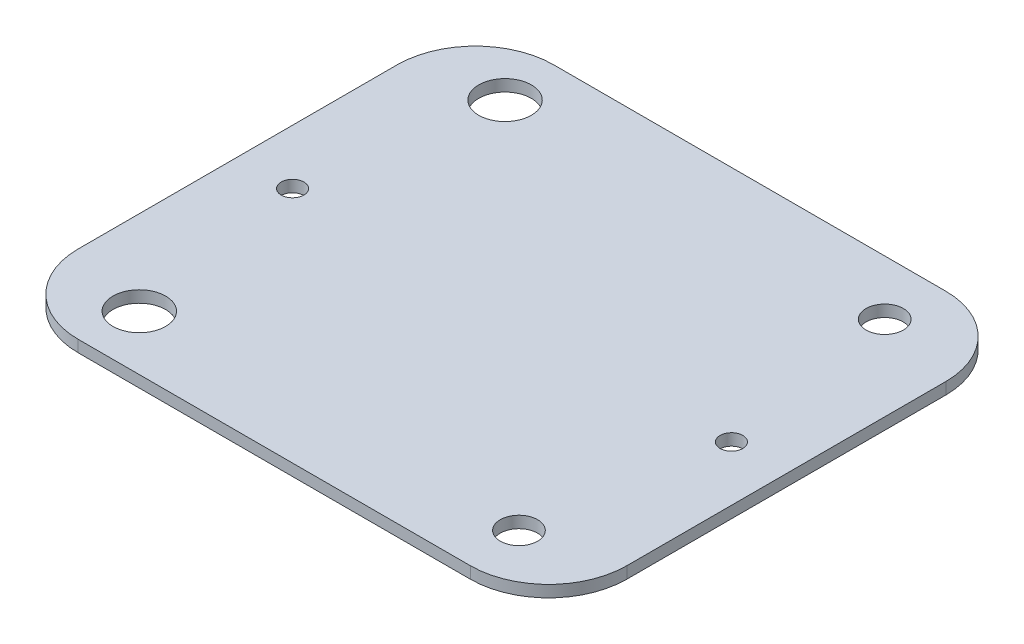
ISO-10303-21;
HEADER;
FILE_DESCRIPTION(('STEP AP214'),'2;1');
FILE_NAME('part.step','',(''),(''),'','','');
FILE_SCHEMA(('AUTOMOTIVE_DESIGN { 1 0 10303 214 1 1 1 1 }'));
ENDSEC;
DATA;
#1=APPLICATION_CONTEXT('core data for automotive mechanical design processes');
#2=APPLICATION_PROTOCOL_DEFINITION('international standard','automotive_design',2000,#1);
#3=PRODUCT_CONTEXT('',#1,'mechanical');
#4=PRODUCT('Part','Part','',(#3));
#5=PRODUCT_RELATED_PRODUCT_CATEGORY('part','',(#4));
#6=PRODUCT_DEFINITION_FORMATION('','',#4);
#7=PRODUCT_DEFINITION_CONTEXT('part definition',#1,'design');
#8=PRODUCT_DEFINITION('design','',#6,#7);
#9=PRODUCT_DEFINITION_SHAPE('','',#8);
#10=(LENGTH_UNIT() NAMED_UNIT(*) SI_UNIT(.MILLI.,.METRE.));
#11=(NAMED_UNIT(*) PLANE_ANGLE_UNIT() SI_UNIT($,.RADIAN.));
#12=(NAMED_UNIT(*) SI_UNIT($,.STERADIAN.) SOLID_ANGLE_UNIT());
#13=UNCERTAINTY_MEASURE_WITH_UNIT(LENGTH_MEASURE(1.E-05),#10,'distance_accuracy_value','');
#14=(GEOMETRIC_REPRESENTATION_CONTEXT(3) GLOBAL_UNCERTAINTY_ASSIGNED_CONTEXT((#13)) GLOBAL_UNIT_ASSIGNED_CONTEXT((#10,
#11,#12)) REPRESENTATION_CONTEXT('',''));
#15=CARTESIAN_POINT('',(0.,0.,0.));
#16=DIRECTION('',(0.,0.,1.));
#17=DIRECTION('',(1.,0.,0.));
#18=AXIS2_PLACEMENT_3D('',#15,#16,#17);
#19=CARTESIAN_POINT('',(-26.8,1.6,-21.8));
#20=DIRECTION('',(0.,-1.,0.));
#21=DIRECTION('',(0.,0.,-1.));
#22=AXIS2_PLACEMENT_3D('',#19,#20,#21);
#23=CYLINDRICAL_SURFACE('',#22,10.7);
#24=CARTESIAN_POINT('',(-26.8,0.,-21.8));
#25=DIRECTION('',(0.,1.,0.));
#26=DIRECTION('',(0.,0.,1.));
#27=AXIS2_PLACEMENT_3D('',#24,#25,#26);
#28=CIRCLE('',#27,10.7);
#29=CARTESIAN_POINT('',(-26.8,0.,-32.5));
#30=VERTEX_POINT('',#29);
#31=CARTESIAN_POINT('',(-37.5,0.,-21.8));
#32=VERTEX_POINT('',#31);
#33=EDGE_CURVE('E131',#30,#32,#28,.T.);
#34=ORIENTED_EDGE('',*,*,#33,.T.);
#35=DIRECTION('',(0.,-1.,0.));
#36=VECTOR('',#35,1.);
#37=CARTESIAN_POINT('',(-37.5,1.6,-21.8));
#38=LINE('',#37,#36);
#39=CARTESIAN_POINT('',(-37.5,1.6,-21.8));
#40=VERTEX_POINT('',#39);
#41=EDGE_CURVE('E11',#40,#32,#38,.T.);
#42=ORIENTED_EDGE('',*,*,#41,.F.);
#43=CARTESIAN_POINT('',(-26.8,1.6,-21.8));
#44=DIRECTION('',(0.,1.,0.));
#45=DIRECTION('',(0.,0.,1.));
#46=AXIS2_PLACEMENT_3D('',#43,#44,#45);
#47=CIRCLE('',#46,10.7);
#48=CARTESIAN_POINT('',(-26.8,1.6,-32.5));
#49=VERTEX_POINT('',#48);
#50=EDGE_CURVE('E149',#49,#40,#47,.T.);
#51=ORIENTED_EDGE('',*,*,#50,.F.);
#52=DIRECTION('',(0.,-1.,0.));
#53=VECTOR('',#52,1.);
#54=CARTESIAN_POINT('',(-26.8,1.6,-32.5));
#55=LINE('',#54,#53);
#56=EDGE_CURVE('E49',#49,#30,#55,.T.);
#57=ORIENTED_EDGE('',*,*,#56,.T.);
#58=EDGE_LOOP('',(#34,#42,#51,#57));
#59=FACE_BOUND('',#58,.T.);
#60=ADVANCED_FACE('F33',(#59),#23,.T.);
#61=CARTESIAN_POINT('',(-37.5,1.6,-21.8));
#62=DIRECTION('',(1.,0.,0.));
#63=DIRECTION('',(0.,0.,-1.));
#64=AXIS2_PLACEMENT_3D('',#61,#62,#63);
#65=PLANE('',#64);
#66=DIRECTION('',(0.,0.,1.));
#67=VECTOR('',#66,1.);
#68=CARTESIAN_POINT('',(-37.5,0.,-21.8));
#69=LINE('',#68,#67);
#70=CARTESIAN_POINT('',(-37.5,0.,21.8));
#71=VERTEX_POINT('',#70);
#72=EDGE_CURVE('E133',#32,#71,#69,.T.);
#73=ORIENTED_EDGE('',*,*,#72,.T.);
#74=DIRECTION('',(0.,-1.,0.));
#75=VECTOR('',#74,1.);
#76=CARTESIAN_POINT('',(-37.5,1.6,21.8));
#77=LINE('',#76,#75);
#78=CARTESIAN_POINT('',(-37.5,1.6,21.8));
#79=VERTEX_POINT('',#78);
#80=EDGE_CURVE('E41',#79,#71,#77,.T.);
#81=ORIENTED_EDGE('',*,*,#80,.F.);
#82=DIRECTION('',(0.,0.,1.));
#83=VECTOR('',#82,1.);
#84=CARTESIAN_POINT('',(-37.5,1.6,-21.8));
#85=LINE('',#84,#83);
#86=EDGE_CURVE('E88',#40,#79,#85,.T.);
#87=ORIENTED_EDGE('',*,*,#86,.F.);
#88=ORIENTED_EDGE('',*,*,#41,.T.);
#89=EDGE_LOOP('',(#73,#81,#87,#88));
#90=FACE_BOUND('',#89,.T.);
#91=ADVANCED_FACE('F187',(#90),#65,.F.);
#92=CARTESIAN_POINT('',(-26.8,1.6,21.8));
#93=DIRECTION('',(0.,-1.,0.));
#94=DIRECTION('',(0.,0.,-1.));
#95=AXIS2_PLACEMENT_3D('',#92,#93,#94);
#96=CYLINDRICAL_SURFACE('',#95,10.7);
#97=CARTESIAN_POINT('',(-26.8,0.,21.8));
#98=DIRECTION('',(0.,1.,0.));
#99=DIRECTION('',(0.,0.,1.));
#100=AXIS2_PLACEMENT_3D('',#97,#98,#99);
#101=CIRCLE('',#100,10.7);
#102=CARTESIAN_POINT('',(-26.8,0.,32.5));
#103=VERTEX_POINT('',#102);
#104=EDGE_CURVE('E136',#71,#103,#101,.T.);
#105=ORIENTED_EDGE('',*,*,#104,.T.);
#106=DIRECTION('',(0.,-1.,0.));
#107=VECTOR('',#106,1.);
#108=CARTESIAN_POINT('',(-26.8,1.6,32.5));
#109=LINE('',#108,#107);
#110=CARTESIAN_POINT('',(-26.8,1.6,32.5));
#111=VERTEX_POINT('',#110);
#112=EDGE_CURVE('E156',#111,#103,#109,.T.);
#113=ORIENTED_EDGE('',*,*,#112,.F.);
#114=CARTESIAN_POINT('',(-26.8,1.6,21.8));
#115=DIRECTION('',(0.,1.,0.));
#116=DIRECTION('',(0.,0.,1.));
#117=AXIS2_PLACEMENT_3D('',#114,#115,#116);
#118=CIRCLE('',#117,10.7);
#119=EDGE_CURVE('E164',#79,#111,#118,.T.);
#120=ORIENTED_EDGE('',*,*,#119,.F.);
#121=ORIENTED_EDGE('',*,*,#80,.T.);
#122=EDGE_LOOP('',(#105,#113,#120,#121));
#123=FACE_BOUND('',#122,.T.);
#124=ADVANCED_FACE('F162',(#123),#96,.T.);
#125=CARTESIAN_POINT('',(-26.8,1.6,32.5));
#126=DIRECTION('',(0.,0.,-1.));
#127=DIRECTION('',(-1.,0.,0.));
#128=AXIS2_PLACEMENT_3D('',#125,#126,#127);
#129=PLANE('',#128);
#130=DIRECTION('',(1.,0.,0.));
#131=VECTOR('',#130,1.);
#132=CARTESIAN_POINT('',(-26.8,0.,32.5));
#133=LINE('',#132,#131);
#134=CARTESIAN_POINT('',(26.8,0.,32.5));
#135=VERTEX_POINT('',#134);
#136=EDGE_CURVE('E138',#103,#135,#133,.T.);
#137=ORIENTED_EDGE('',*,*,#136,.T.);
#138=DIRECTION('',(0.,-1.,0.));
#139=VECTOR('',#138,1.);
#140=CARTESIAN_POINT('',(26.8,1.6,32.5));
#141=LINE('',#140,#139);
#142=CARTESIAN_POINT('',(26.8,1.6,32.5));
#143=VERTEX_POINT('',#142);
#144=EDGE_CURVE('E153',#143,#135,#141,.T.);
#145=ORIENTED_EDGE('',*,*,#144,.F.);
#146=DIRECTION('',(1.,0.,0.));
#147=VECTOR('',#146,1.);
#148=CARTESIAN_POINT('',(-26.8,1.6,32.5));
#149=LINE('',#148,#147);
#150=EDGE_CURVE('E126',#111,#143,#149,.T.);
#151=ORIENTED_EDGE('',*,*,#150,.F.);
#152=ORIENTED_EDGE('',*,*,#112,.T.);
#153=EDGE_LOOP('',(#137,#145,#151,#152));
#154=FACE_BOUND('',#153,.T.);
#155=ADVANCED_FACE('F171',(#154),#129,.F.);
#156=CARTESIAN_POINT('',(26.8,1.6,21.8));
#157=DIRECTION('',(0.,-1.,0.));
#158=DIRECTION('',(0.,0.,-1.));
#159=AXIS2_PLACEMENT_3D('',#156,#157,#158);
#160=CYLINDRICAL_SURFACE('',#159,10.7);
#161=CARTESIAN_POINT('',(26.8,0.,21.8));
#162=DIRECTION('',(0.,1.,0.));
#163=DIRECTION('',(0.,0.,1.));
#164=AXIS2_PLACEMENT_3D('',#161,#162,#163);
#165=CIRCLE('',#164,10.7);
#166=CARTESIAN_POINT('',(37.5,0.,21.8));
#167=VERTEX_POINT('',#166);
#168=EDGE_CURVE('E140',#135,#167,#165,.T.);
#169=ORIENTED_EDGE('',*,*,#168,.T.);
#170=DIRECTION('',(0.,-1.,0.));
#171=VECTOR('',#170,1.);
#172=CARTESIAN_POINT('',(37.5,1.6,21.8));
#173=LINE('',#172,#171);
#174=CARTESIAN_POINT('',(37.5,1.6,21.8));
#175=VERTEX_POINT('',#174);
#176=EDGE_CURVE('E113',#175,#167,#173,.T.);
#177=ORIENTED_EDGE('',*,*,#176,.F.);
#178=CARTESIAN_POINT('',(26.8,1.6,21.8));
#179=DIRECTION('',(0.,1.,0.));
#180=DIRECTION('',(0.,0.,1.));
#181=AXIS2_PLACEMENT_3D('',#178,#179,#180);
#182=CIRCLE('',#181,10.7);
#183=EDGE_CURVE('E123',#143,#175,#182,.T.);
#184=ORIENTED_EDGE('',*,*,#183,.F.);
#185=ORIENTED_EDGE('',*,*,#144,.T.);
#186=EDGE_LOOP('',(#169,#177,#184,#185));
#187=FACE_BOUND('',#186,.T.);
#188=ADVANCED_FACE('F174',(#187),#160,.T.);
#189=CARTESIAN_POINT('',(37.5,1.6,-21.8));
#190=DIRECTION('',(1.,0.,0.));
#191=DIRECTION('',(0.,0.,-1.));
#192=AXIS2_PLACEMENT_3D('',#189,#190,#191);
#193=PLANE('',#192);
#194=DIRECTION('',(0.,0.,1.));
#195=VECTOR('',#194,1.);
#196=CARTESIAN_POINT('',(37.5,0.,-21.8));
#197=LINE('',#196,#195);
#198=CARTESIAN_POINT('',(37.5,0.,-21.8));
#199=VERTEX_POINT('',#198);
#200=EDGE_CURVE('E110',#199,#167,#197,.T.);
#201=ORIENTED_EDGE('',*,*,#200,.F.);
#202=DIRECTION('',(0.,-1.,0.));
#203=VECTOR('',#202,1.);
#204=CARTESIAN_POINT('',(37.5,1.6,-21.8));
#205=LINE('',#204,#203);
#206=CARTESIAN_POINT('',(37.5,1.6,-21.8));
#207=VERTEX_POINT('',#206);
#208=EDGE_CURVE('E104',#207,#199,#205,.T.);
#209=ORIENTED_EDGE('',*,*,#208,.F.);
#210=DIRECTION('',(0.,0.,1.));
#211=VECTOR('',#210,1.);
#212=CARTESIAN_POINT('',(37.5,1.6,-21.8));
#213=LINE('',#212,#211);
#214=EDGE_CURVE('E108',#207,#175,#213,.T.);
#215=ORIENTED_EDGE('',*,*,#214,.T.);
#216=ORIENTED_EDGE('',*,*,#176,.T.);
#217=EDGE_LOOP('',(#201,#209,#215,#216));
#218=FACE_BOUND('',#217,.T.);
#219=ADVANCED_FACE('F106',(#218),#193,.T.);
#220=CARTESIAN_POINT('',(26.8,1.6,-21.8));
#221=DIRECTION('',(0.,-1.,0.));
#222=DIRECTION('',(0.,0.,-1.));
#223=AXIS2_PLACEMENT_3D('',#220,#221,#222);
#224=CYLINDRICAL_SURFACE('',#223,10.7);
#225=CARTESIAN_POINT('',(26.8,0.,-21.8));
#226=DIRECTION('',(0.,1.,0.));
#227=DIRECTION('',(0.,0.,1.));
#228=AXIS2_PLACEMENT_3D('',#225,#226,#227);
#229=CIRCLE('',#228,10.7);
#230=CARTESIAN_POINT('',(26.8,0.,-32.5));
#231=VERTEX_POINT('',#230);
#232=EDGE_CURVE('E144',#199,#231,#229,.T.);
#233=ORIENTED_EDGE('',*,*,#232,.T.);
#234=DIRECTION('',(0.,-1.,0.));
#235=VECTOR('',#234,1.);
#236=CARTESIAN_POINT('',(26.8,1.6,-32.5));
#237=LINE('',#236,#235);
#238=CARTESIAN_POINT('',(26.8,1.6,-32.5));
#239=VERTEX_POINT('',#238);
#240=EDGE_CURVE('E76',#239,#231,#237,.T.);
#241=ORIENTED_EDGE('',*,*,#240,.F.);
#242=CARTESIAN_POINT('',(26.8,1.6,-21.8));
#243=DIRECTION('',(0.,1.,0.));
#244=DIRECTION('',(0.,0.,1.));
#245=AXIS2_PLACEMENT_3D('',#242,#243,#244);
#246=CIRCLE('',#245,10.7);
#247=EDGE_CURVE('E115',#207,#239,#246,.T.);
#248=ORIENTED_EDGE('',*,*,#247,.F.);
#249=ORIENTED_EDGE('',*,*,#208,.T.);
#250=EDGE_LOOP('',(#233,#241,#248,#249));
#251=FACE_BOUND('',#250,.T.);
#252=ADVANCED_FACE('F116',(#251),#224,.T.);
#253=CARTESIAN_POINT('',(-26.8,1.6,-32.5));
#254=DIRECTION('',(0.,0.,-1.));
#255=DIRECTION('',(-1.,0.,0.));
#256=AXIS2_PLACEMENT_3D('',#253,#254,#255);
#257=PLANE('',#256);
#258=DIRECTION('',(1.,0.,0.));
#259=VECTOR('',#258,1.);
#260=CARTESIAN_POINT('',(-26.8,0.,-32.5));
#261=LINE('',#260,#259);
#262=EDGE_CURVE('E146',#30,#231,#261,.T.);
#263=ORIENTED_EDGE('',*,*,#262,.F.);
#264=ORIENTED_EDGE('',*,*,#56,.F.);
#265=DIRECTION('',(1.,0.,0.));
#266=VECTOR('',#265,1.);
#267=CARTESIAN_POINT('',(-26.8,1.6,-32.5));
#268=LINE('',#267,#266);
#269=EDGE_CURVE('E119',#49,#239,#268,.T.);
#270=ORIENTED_EDGE('',*,*,#269,.T.);
#271=ORIENTED_EDGE('',*,*,#240,.T.);
#272=EDGE_LOOP('',(#263,#264,#270,#271));
#273=FACE_BOUND('',#272,.T.);
#274=ADVANCED_FACE('F175',(#273),#257,.T.);
#275=CARTESIAN_POINT('',(-26.8,1.6,-21.8));
#276=DIRECTION('',(0.,1.,0.));
#277=DIRECTION('',(0.,0.,1.));
#278=AXIS2_PLACEMENT_3D('',#275,#276,#277);
#279=PLANE('',#278);
#280=CARTESIAN_POINT('',(30.,1.6,0.));
#281=DIRECTION('',(0.,1.,0.));
#282=DIRECTION('',(0.,0.,1.));
#283=AXIS2_PLACEMENT_3D('',#280,#281,#282);
#284=CIRCLE('',#283,1.55);
#285=CARTESIAN_POINT('',(30.,1.6,1.54999999999999));
#286=VERTEX_POINT('',#285);
#287=EDGE_CURVE('E228',#286,#286,#284,.T.);
#288=ORIENTED_EDGE('',*,*,#287,.F.);
#289=EDGE_LOOP('',(#288));
#290=FACE_BOUND('',#289,.T.);
#291=CARTESIAN_POINT('',(-30.,1.6,0.));
#292=DIRECTION('',(0.,1.,0.));
#293=DIRECTION('',(0.,0.,1.));
#294=AXIS2_PLACEMENT_3D('',#291,#292,#293);
#295=CIRCLE('',#294,1.55);
#296=CARTESIAN_POINT('',(-30.,1.6,1.55));
#297=VERTEX_POINT('',#296);
#298=EDGE_CURVE('E222',#297,#297,#295,.T.);
#299=ORIENTED_EDGE('',*,*,#298,.F.);
#300=EDGE_LOOP('',(#299));
#301=FACE_BOUND('',#300,.T.);
#302=CARTESIAN_POINT('',(25.95,1.6,25.));
#303=DIRECTION('',(0.,1.,0.));
#304=DIRECTION('',(0.,0.,1.));
#305=AXIS2_PLACEMENT_3D('',#302,#303,#304);
#306=CIRCLE('',#305,2.55);
#307=CARTESIAN_POINT('',(25.95,1.6,27.55));
#308=VERTEX_POINT('',#307);
#309=EDGE_CURVE('E213',#308,#308,#306,.T.);
#310=ORIENTED_EDGE('',*,*,#309,.F.);
#311=EDGE_LOOP('',(#310));
#312=FACE_BOUND('',#311,.T.);
#313=CARTESIAN_POINT('',(-25.95,1.6,25.));
#314=DIRECTION('',(0.,1.,0.));
#315=DIRECTION('',(0.,0.,1.));
#316=AXIS2_PLACEMENT_3D('',#313,#314,#315);
#317=CIRCLE('',#316,3.6);
#318=CARTESIAN_POINT('',(-25.95,1.6,28.6));
#319=VERTEX_POINT('',#318);
#320=EDGE_CURVE('E205',#319,#319,#317,.T.);
#321=ORIENTED_EDGE('',*,*,#320,.F.);
#322=EDGE_LOOP('',(#321));
#323=FACE_BOUND('',#322,.T.);
#324=CARTESIAN_POINT('',(-25.95,1.6,-25.));
#325=DIRECTION('',(0.,1.,0.));
#326=DIRECTION('',(0.,0.,1.));
#327=AXIS2_PLACEMENT_3D('',#324,#325,#326);
#328=CIRCLE('',#327,3.6);
#329=CARTESIAN_POINT('',(-25.95,1.6,-21.4));
#330=VERTEX_POINT('',#329);
#331=EDGE_CURVE('E206',#330,#330,#328,.T.);
#332=ORIENTED_EDGE('',*,*,#331,.F.);
#333=EDGE_LOOP('',(#332));
#334=FACE_BOUND('',#333,.T.);
#335=CARTESIAN_POINT('',(25.95,1.6,-25.));
#336=DIRECTION('',(0.,1.,0.));
#337=DIRECTION('',(0.,0.,1.));
#338=AXIS2_PLACEMENT_3D('',#335,#336,#337);
#339=CIRCLE('',#338,2.55);
#340=CARTESIAN_POINT('',(25.95,1.6,-22.45));
#341=VERTEX_POINT('',#340);
#342=EDGE_CURVE('E198',#341,#341,#339,.T.);
#343=ORIENTED_EDGE('',*,*,#342,.F.);
#344=EDGE_LOOP('',(#343));
#345=FACE_BOUND('',#344,.T.);
#346=ORIENTED_EDGE('',*,*,#50,.T.);
#347=ORIENTED_EDGE('',*,*,#86,.T.);
#348=ORIENTED_EDGE('',*,*,#119,.T.);
#349=ORIENTED_EDGE('',*,*,#150,.T.);
#350=ORIENTED_EDGE('',*,*,#183,.T.);
#351=ORIENTED_EDGE('',*,*,#214,.F.);
#352=ORIENTED_EDGE('',*,*,#247,.T.);
#353=ORIENTED_EDGE('',*,*,#269,.F.);
#354=EDGE_LOOP('',(#346,#347,#348,#349,#350,#351,#352,#353));
#355=FACE_BOUND('',#354,.T.);
#356=ADVANCED_FACE('F121',(#290,#301,#312,#323,#334,#345,#355),#279,.T.);
#357=CARTESIAN_POINT('',(-26.8,0.,-21.8));
#358=DIRECTION('',(0.,1.,0.));
#359=DIRECTION('',(0.,0.,1.));
#360=AXIS2_PLACEMENT_3D('',#357,#358,#359);
#361=PLANE('',#360);
#362=CARTESIAN_POINT('',(30.,0.,0.));
#363=DIRECTION('',(0.,1.,0.));
#364=DIRECTION('',(0.,0.,1.));
#365=AXIS2_PLACEMENT_3D('',#362,#363,#364);
#366=CIRCLE('',#365,1.55);
#367=CARTESIAN_POINT('',(30.,0.,1.54999999999999));
#368=VERTEX_POINT('',#367);
#369=EDGE_CURVE('E225',#368,#368,#366,.F.);
#370=ORIENTED_EDGE('',*,*,#369,.F.);
#371=EDGE_LOOP('',(#370));
#372=FACE_BOUND('',#371,.T.);
#373=CARTESIAN_POINT('',(-30.,0.,0.));
#374=DIRECTION('',(0.,1.,0.));
#375=DIRECTION('',(0.,0.,1.));
#376=AXIS2_PLACEMENT_3D('',#373,#374,#375);
#377=CIRCLE('',#376,1.55);
#378=CARTESIAN_POINT('',(-30.,0.,1.55));
#379=VERTEX_POINT('',#378);
#380=EDGE_CURVE('E209',#379,#379,#377,.F.);
#381=ORIENTED_EDGE('',*,*,#380,.F.);
#382=EDGE_LOOP('',(#381));
#383=FACE_BOUND('',#382,.T.);
#384=CARTESIAN_POINT('',(25.95,0.,25.));
#385=DIRECTION('',(0.,1.,0.));
#386=DIRECTION('',(0.,0.,1.));
#387=AXIS2_PLACEMENT_3D('',#384,#385,#386);
#388=CIRCLE('',#387,2.55);
#389=CARTESIAN_POINT('',(25.95,0.,27.55));
#390=VERTEX_POINT('',#389);
#391=EDGE_CURVE('E201',#390,#390,#388,.F.);
#392=ORIENTED_EDGE('',*,*,#391,.F.);
#393=EDGE_LOOP('',(#392));
#394=FACE_BOUND('',#393,.T.);
#395=CARTESIAN_POINT('',(-25.95,0.,25.));
#396=DIRECTION('',(0.,1.,0.));
#397=DIRECTION('',(0.,0.,1.));
#398=AXIS2_PLACEMENT_3D('',#395,#396,#397);
#399=CIRCLE('',#398,3.6);
#400=CARTESIAN_POINT('',(-25.95,0.,28.6));
#401=VERTEX_POINT('',#400);
#402=EDGE_CURVE('E210',#401,#401,#399,.F.);
#403=ORIENTED_EDGE('',*,*,#402,.F.);
#404=EDGE_LOOP('',(#403));
#405=FACE_BOUND('',#404,.T.);
#406=CARTESIAN_POINT('',(-25.95,0.,-25.));
#407=DIRECTION('',(0.,1.,0.));
#408=DIRECTION('',(0.,0.,1.));
#409=AXIS2_PLACEMENT_3D('',#406,#407,#408);
#410=CIRCLE('',#409,3.6);
#411=CARTESIAN_POINT('',(-25.95,0.,-21.4));
#412=VERTEX_POINT('',#411);
#413=EDGE_CURVE('E202',#412,#412,#410,.F.);
#414=ORIENTED_EDGE('',*,*,#413,.F.);
#415=EDGE_LOOP('',(#414));
#416=FACE_BOUND('',#415,.T.);
#417=CARTESIAN_POINT('',(25.95,0.,-25.));
#418=DIRECTION('',(0.,1.,0.));
#419=DIRECTION('',(0.,0.,1.));
#420=AXIS2_PLACEMENT_3D('',#417,#418,#419);
#421=CIRCLE('',#420,2.55);
#422=CARTESIAN_POINT('',(25.95,0.,-22.45));
#423=VERTEX_POINT('',#422);
#424=EDGE_CURVE('E134',#423,#423,#421,.F.);
#425=ORIENTED_EDGE('',*,*,#424,.F.);
#426=EDGE_LOOP('',(#425));
#427=FACE_BOUND('',#426,.T.);
#428=ORIENTED_EDGE('',*,*,#33,.F.);
#429=ORIENTED_EDGE('',*,*,#262,.T.);
#430=ORIENTED_EDGE('',*,*,#232,.F.);
#431=ORIENTED_EDGE('',*,*,#200,.T.);
#432=ORIENTED_EDGE('',*,*,#168,.F.);
#433=ORIENTED_EDGE('',*,*,#136,.F.);
#434=ORIENTED_EDGE('',*,*,#104,.F.);
#435=ORIENTED_EDGE('',*,*,#72,.F.);
#436=EDGE_LOOP('',(#428,#429,#430,#431,#432,#433,#434,#435));
#437=FACE_BOUND('',#436,.T.);
#438=ADVANCED_FACE('F167',(#372,#383,#394,#405,#416,#427,#437),#361,.F.);
#439=CARTESIAN_POINT('',(25.95,-10.1823376490863,-25.));
#440=DIRECTION('',(0.,1.,0.));
#441=DIRECTION('',(0.,0.,1.));
#442=AXIS2_PLACEMENT_3D('',#439,#440,#441);
#443=CYLINDRICAL_SURFACE('',#442,2.55);
#444=CARTESIAN_POINT('',(25.95,0.,-22.45));
#445=CARTESIAN_POINT('',(25.95,0.0166666666666648,-22.45));
#446=CARTESIAN_POINT('',(25.95,0.0333333333333314,-22.45));
#447=CARTESIAN_POINT('',(25.95,0.0666666666666645,-22.45));
#448=CARTESIAN_POINT('',(25.95,0.0833333333333311,-22.45));
#449=CARTESIAN_POINT('',(25.95,0.116666666666665,-22.45));
#450=CARTESIAN_POINT('',(25.95,0.133333333333332,-22.45));
#451=CARTESIAN_POINT('',(25.95,0.166666666666666,-22.45));
#452=CARTESIAN_POINT('',(25.95,0.183333333333332,-22.45));
#453=CARTESIAN_POINT('',(25.95,0.216666666666665,-22.45));
#454=CARTESIAN_POINT('',(25.95,0.233333333333332,-22.45));
#455=CARTESIAN_POINT('',(25.95,0.266666666666665,-22.45));
#456=CARTESIAN_POINT('',(25.95,0.283333333333332,-22.45));
#457=CARTESIAN_POINT('',(25.95,0.316666666666665,-22.45));
#458=CARTESIAN_POINT('',(25.95,0.333333333333331,-22.45));
#459=CARTESIAN_POINT('',(25.95,0.366666666666665,-22.45));
#460=CARTESIAN_POINT('',(25.95,0.383333333333332,-22.45));
#461=CARTESIAN_POINT('',(25.95,0.416666666666666,-22.45));
#462=CARTESIAN_POINT('',(25.95,0.433333333333332,-22.45));
#463=CARTESIAN_POINT('',(25.95,0.466666666666666,-22.45));
#464=CARTESIAN_POINT('',(25.95,0.483333333333332,-22.45));
#465=CARTESIAN_POINT('',(25.95,0.516666666666665,-22.45));
#466=CARTESIAN_POINT('',(25.95,0.533333333333332,-22.45));
#467=CARTESIAN_POINT('',(25.95,0.566666666666665,-22.45));
#468=CARTESIAN_POINT('',(25.95,0.583333333333331,-22.45));
#469=CARTESIAN_POINT('',(25.95,0.616666666666665,-22.45));
#470=CARTESIAN_POINT('',(25.95,0.633333333333331,-22.45));
#471=CARTESIAN_POINT('',(25.95,0.666666666666665,-22.45));
#472=CARTESIAN_POINT('',(25.95,0.683333333333332,-22.45));
#473=CARTESIAN_POINT('',(25.95,0.716666666666666,-22.45));
#474=CARTESIAN_POINT('',(25.95,0.733333333333332,-22.45));
#475=CARTESIAN_POINT('',(25.95,0.766666666666665,-22.45));
#476=CARTESIAN_POINT('',(25.95,0.783333333333332,-22.45));
#477=CARTESIAN_POINT('',(25.95,0.816666666666665,-22.45));
#478=CARTESIAN_POINT('',(25.95,0.833333333333332,-22.45));
#479=CARTESIAN_POINT('',(25.95,0.866666666666665,-22.45));
#480=CARTESIAN_POINT('',(25.95,0.883333333333331,-22.45));
#481=CARTESIAN_POINT('',(25.95,0.916666666666665,-22.45));
#482=CARTESIAN_POINT('',(25.95,0.933333333333332,-22.45));
#483=CARTESIAN_POINT('',(25.95,0.966666666666666,-22.45));
#484=CARTESIAN_POINT('',(25.95,0.983333333333333,-22.45));
#485=CARTESIAN_POINT('',(25.95,1.01666666666667,-22.45));
#486=CARTESIAN_POINT('',(25.95,1.03333333333333,-22.45));
#487=CARTESIAN_POINT('',(25.95,1.06666666666667,-22.45));
#488=CARTESIAN_POINT('',(25.95,1.08333333333333,-22.45));
#489=CARTESIAN_POINT('',(25.95,1.11666666666667,-22.45));
#490=CARTESIAN_POINT('',(25.95,1.13333333333333,-22.45));
#491=CARTESIAN_POINT('',(25.95,1.16666666666666,-22.45));
#492=CARTESIAN_POINT('',(25.95,1.18333333333333,-22.45));
#493=CARTESIAN_POINT('',(25.95,1.21666666666667,-22.45));
#494=CARTESIAN_POINT('',(25.95,1.23333333333333,-22.45));
#495=CARTESIAN_POINT('',(25.95,1.26666666666667,-22.45));
#496=CARTESIAN_POINT('',(25.95,1.28333333333333,-22.45));
#497=CARTESIAN_POINT('',(25.95,1.31666666666667,-22.45));
#498=CARTESIAN_POINT('',(25.95,1.33333333333333,-22.45));
#499=CARTESIAN_POINT('',(25.95,1.36666666666667,-22.45));
#500=CARTESIAN_POINT('',(25.95,1.38333333333333,-22.45));
#501=CARTESIAN_POINT('',(25.95,1.41666666666666,-22.45));
#502=CARTESIAN_POINT('',(25.95,1.43333333333333,-22.45));
#503=CARTESIAN_POINT('',(25.95,1.46666666666667,-22.45));
#504=CARTESIAN_POINT('',(25.95,1.48333333333333,-22.45));
#505=CARTESIAN_POINT('',(25.95,1.51666666666667,-22.45));
#506=CARTESIAN_POINT('',(25.95,1.53333333333333,-22.45));
#507=CARTESIAN_POINT('',(25.95,1.56666666666667,-22.45));
#508=CARTESIAN_POINT('',(25.95,1.58333333333333,-22.45));
#509=CARTESIAN_POINT('',(25.95,1.6,-22.45));
#510=B_SPLINE_CURVE_WITH_KNOTS('',3,(#444,#445,#446,#447,#448,#449,#450,#451,#452,#453,#454,
#455,#456,#457,#458,#459,#460,#461,#462,#463,#464,#465,#466,#467,#468,#469,#470,#471,#472,#473,
#474,#475,#476,#477,#478,#479,#480,#481,#482,#483,#484,#485,#486,#487,#488,#489,#490,#491,#492,
#493,#494,#495,#496,#497,#498,#499,#500,#501,#502,#503,#504,#505,#506,#507,#508,#509),
.UNSPECIFIED.,.F.,.F.,(4,2,2,2,2,2,2,2,2,2,2,2,2,2,2,2,2,2,2,2,2,2,2,2,2,2,2,2,2,2,2,2,4),(0.,
0.0499999999999997,0.0999999999999994,0.150000000000001,0.200000000000001,0.25,0.3,0.35,
0.400000000000001,0.450000000000001,0.5,0.55,0.6,0.65,0.700000000000001,0.750000000000001,0.8,
0.85,0.9,0.950000000000001,1.,1.05,1.1,1.15,1.2,1.25,1.3,1.35,1.4,1.45,1.5,1.55,1.6),.UNSPECIFIED.);
#511=EDGE_CURVE('BSEAM244',#423,#341,#510,.T.);
#512=ORIENTED_EDGE('',*,*,#424,.T.);
#513=ORIENTED_EDGE('',*,*,#342,.T.);
#514=ORIENTED_EDGE('',*,*,#511,.T.);
#515=ORIENTED_EDGE('',*,*,#511,.F.);
#516=EDGE_LOOP('',(#512,#514,#513,#515));
#517=FACE_BOUND('',#516,.T.);
#518=ADVANCED_FACE('F244',(#517),#443,.F.);
#519=CARTESIAN_POINT('',(-25.95,-10.1823376490863,-25.));
#520=DIRECTION('',(0.,1.,0.));
#521=DIRECTION('',(0.,0.,1.));
#522=AXIS2_PLACEMENT_3D('',#519,#520,#521);
#523=CYLINDRICAL_SURFACE('',#522,3.6);
#524=CARTESIAN_POINT('',(-25.95,0.,-21.4));
#525=CARTESIAN_POINT('',(-25.95,0.0166666666666648,-21.4));
#526=CARTESIAN_POINT('',(-25.95,0.0333333333333314,-21.4));
#527=CARTESIAN_POINT('',(-25.95,0.0666666666666645,-21.4));
#528=CARTESIAN_POINT('',(-25.95,0.0833333333333311,-21.4));
#529=CARTESIAN_POINT('',(-25.95,0.116666666666665,-21.4));
#530=CARTESIAN_POINT('',(-25.95,0.133333333333332,-21.4));
#531=CARTESIAN_POINT('',(-25.95,0.166666666666666,-21.4));
#532=CARTESIAN_POINT('',(-25.95,0.183333333333332,-21.4));
#533=CARTESIAN_POINT('',(-25.95,0.216666666666665,-21.4));
#534=CARTESIAN_POINT('',(-25.95,0.233333333333332,-21.4));
#535=CARTESIAN_POINT('',(-25.95,0.266666666666665,-21.4));
#536=CARTESIAN_POINT('',(-25.95,0.283333333333332,-21.4));
#537=CARTESIAN_POINT('',(-25.95,0.316666666666665,-21.4));
#538=CARTESIAN_POINT('',(-25.95,0.333333333333331,-21.4));
#539=CARTESIAN_POINT('',(-25.95,0.366666666666665,-21.4));
#540=CARTESIAN_POINT('',(-25.95,0.383333333333332,-21.4));
#541=CARTESIAN_POINT('',(-25.95,0.416666666666666,-21.4));
#542=CARTESIAN_POINT('',(-25.95,0.433333333333332,-21.4));
#543=CARTESIAN_POINT('',(-25.95,0.466666666666666,-21.4));
#544=CARTESIAN_POINT('',(-25.95,0.483333333333332,-21.4));
#545=CARTESIAN_POINT('',(-25.95,0.516666666666665,-21.4));
#546=CARTESIAN_POINT('',(-25.95,0.533333333333332,-21.4));
#547=CARTESIAN_POINT('',(-25.95,0.566666666666665,-21.4));
#548=CARTESIAN_POINT('',(-25.95,0.583333333333331,-21.4));
#549=CARTESIAN_POINT('',(-25.95,0.616666666666665,-21.4));
#550=CARTESIAN_POINT('',(-25.95,0.633333333333331,-21.4));
#551=CARTESIAN_POINT('',(-25.95,0.666666666666665,-21.4));
#552=CARTESIAN_POINT('',(-25.95,0.683333333333332,-21.4));
#553=CARTESIAN_POINT('',(-25.95,0.716666666666666,-21.4));
#554=CARTESIAN_POINT('',(-25.95,0.733333333333332,-21.4));
#555=CARTESIAN_POINT('',(-25.95,0.766666666666665,-21.4));
#556=CARTESIAN_POINT('',(-25.95,0.783333333333332,-21.4));
#557=CARTESIAN_POINT('',(-25.95,0.816666666666665,-21.4));
#558=CARTESIAN_POINT('',(-25.95,0.833333333333332,-21.4));
#559=CARTESIAN_POINT('',(-25.95,0.866666666666665,-21.4));
#560=CARTESIAN_POINT('',(-25.95,0.883333333333331,-21.4));
#561=CARTESIAN_POINT('',(-25.95,0.916666666666665,-21.4));
#562=CARTESIAN_POINT('',(-25.95,0.933333333333332,-21.4));
#563=CARTESIAN_POINT('',(-25.95,0.966666666666666,-21.4));
#564=CARTESIAN_POINT('',(-25.95,0.983333333333333,-21.4));
#565=CARTESIAN_POINT('',(-25.95,1.01666666666667,-21.4));
#566=CARTESIAN_POINT('',(-25.95,1.03333333333333,-21.4));
#567=CARTESIAN_POINT('',(-25.95,1.06666666666667,-21.4));
#568=CARTESIAN_POINT('',(-25.95,1.08333333333333,-21.4));
#569=CARTESIAN_POINT('',(-25.95,1.11666666666667,-21.4));
#570=CARTESIAN_POINT('',(-25.95,1.13333333333333,-21.4));
#571=CARTESIAN_POINT('',(-25.95,1.16666666666666,-21.4));
#572=CARTESIAN_POINT('',(-25.95,1.18333333333333,-21.4));
#573=CARTESIAN_POINT('',(-25.95,1.21666666666667,-21.4));
#574=CARTESIAN_POINT('',(-25.95,1.23333333333333,-21.4));
#575=CARTESIAN_POINT('',(-25.95,1.26666666666667,-21.4));
#576=CARTESIAN_POINT('',(-25.95,1.28333333333333,-21.4));
#577=CARTESIAN_POINT('',(-25.95,1.31666666666667,-21.4));
#578=CARTESIAN_POINT('',(-25.95,1.33333333333333,-21.4));
#579=CARTESIAN_POINT('',(-25.95,1.36666666666667,-21.4));
#580=CARTESIAN_POINT('',(-25.95,1.38333333333333,-21.4));
#581=CARTESIAN_POINT('',(-25.95,1.41666666666666,-21.4));
#582=CARTESIAN_POINT('',(-25.95,1.43333333333333,-21.4));
#583=CARTESIAN_POINT('',(-25.95,1.46666666666667,-21.4));
#584=CARTESIAN_POINT('',(-25.95,1.48333333333333,-21.4));
#585=CARTESIAN_POINT('',(-25.95,1.51666666666667,-21.4));
#586=CARTESIAN_POINT('',(-25.95,1.53333333333333,-21.4));
#587=CARTESIAN_POINT('',(-25.95,1.56666666666667,-21.4));
#588=CARTESIAN_POINT('',(-25.95,1.58333333333333,-21.4));
#589=CARTESIAN_POINT('',(-25.95,1.6,-21.4));
#590=B_SPLINE_CURVE_WITH_KNOTS('',3,(#524,#525,#526,#527,#528,#529,#530,#531,#532,#533,#534,
#535,#536,#537,#538,#539,#540,#541,#542,#543,#544,#545,#546,#547,#548,#549,#550,#551,#552,#553,
#554,#555,#556,#557,#558,#559,#560,#561,#562,#563,#564,#565,#566,#567,#568,#569,#570,#571,#572,
#573,#574,#575,#576,#577,#578,#579,#580,#581,#582,#583,#584,#585,#586,#587,#588,#589),
.UNSPECIFIED.,.F.,.F.,(4,2,2,2,2,2,2,2,2,2,2,2,2,2,2,2,2,2,2,2,2,2,2,2,2,2,2,2,2,2,2,2,4),(0.,
0.0499999999999997,0.0999999999999994,0.150000000000001,0.200000000000001,0.25,0.3,0.35,
0.400000000000001,0.450000000000001,0.5,0.55,0.6,0.65,0.700000000000001,0.750000000000001,0.8,
0.85,0.9,0.950000000000001,1.,1.05,1.1,1.15,1.2,1.25,1.3,1.35,1.4,1.45,1.5,1.55,1.6),.UNSPECIFIED.);
#591=EDGE_CURVE('BSEAM246',#412,#330,#590,.T.);
#592=ORIENTED_EDGE('',*,*,#413,.T.);
#593=ORIENTED_EDGE('',*,*,#331,.T.);
#594=ORIENTED_EDGE('',*,*,#591,.T.);
#595=ORIENTED_EDGE('',*,*,#591,.F.);
#596=EDGE_LOOP('',(#592,#594,#593,#595));
#597=FACE_BOUND('',#596,.T.);
#598=ADVANCED_FACE('F246',(#597),#523,.F.);
#599=CARTESIAN_POINT('',(-25.95,-10.1823376490863,25.));
#600=DIRECTION('',(0.,1.,0.));
#601=DIRECTION('',(0.,0.,1.));
#602=AXIS2_PLACEMENT_3D('',#599,#600,#601);
#603=CYLINDRICAL_SURFACE('',#602,3.6);
#604=CARTESIAN_POINT('',(-25.95,0.,28.6));
#605=CARTESIAN_POINT('',(-25.95,0.0166666666666648,28.6));
#606=CARTESIAN_POINT('',(-25.95,0.0333333333333314,28.6));
#607=CARTESIAN_POINT('',(-25.95,0.0666666666666645,28.6));
#608=CARTESIAN_POINT('',(-25.95,0.0833333333333311,28.6));
#609=CARTESIAN_POINT('',(-25.95,0.116666666666665,28.6));
#610=CARTESIAN_POINT('',(-25.95,0.133333333333332,28.6));
#611=CARTESIAN_POINT('',(-25.95,0.166666666666666,28.6));
#612=CARTESIAN_POINT('',(-25.95,0.183333333333332,28.6));
#613=CARTESIAN_POINT('',(-25.95,0.216666666666665,28.6));
#614=CARTESIAN_POINT('',(-25.95,0.233333333333332,28.6));
#615=CARTESIAN_POINT('',(-25.95,0.266666666666665,28.6));
#616=CARTESIAN_POINT('',(-25.95,0.283333333333332,28.6));
#617=CARTESIAN_POINT('',(-25.95,0.316666666666665,28.6));
#618=CARTESIAN_POINT('',(-25.95,0.333333333333331,28.6));
#619=CARTESIAN_POINT('',(-25.95,0.366666666666665,28.6));
#620=CARTESIAN_POINT('',(-25.95,0.383333333333332,28.6));
#621=CARTESIAN_POINT('',(-25.95,0.416666666666666,28.6));
#622=CARTESIAN_POINT('',(-25.95,0.433333333333332,28.6));
#623=CARTESIAN_POINT('',(-25.95,0.466666666666666,28.6));
#624=CARTESIAN_POINT('',(-25.95,0.483333333333332,28.6));
#625=CARTESIAN_POINT('',(-25.95,0.516666666666665,28.6));
#626=CARTESIAN_POINT('',(-25.95,0.533333333333332,28.6));
#627=CARTESIAN_POINT('',(-25.95,0.566666666666665,28.6));
#628=CARTESIAN_POINT('',(-25.95,0.583333333333331,28.6));
#629=CARTESIAN_POINT('',(-25.95,0.616666666666665,28.6));
#630=CARTESIAN_POINT('',(-25.95,0.633333333333331,28.6));
#631=CARTESIAN_POINT('',(-25.95,0.666666666666665,28.6));
#632=CARTESIAN_POINT('',(-25.95,0.683333333333332,28.6));
#633=CARTESIAN_POINT('',(-25.95,0.716666666666666,28.6));
#634=CARTESIAN_POINT('',(-25.95,0.733333333333332,28.6));
#635=CARTESIAN_POINT('',(-25.95,0.766666666666665,28.6));
#636=CARTESIAN_POINT('',(-25.95,0.783333333333332,28.6));
#637=CARTESIAN_POINT('',(-25.95,0.816666666666665,28.6));
#638=CARTESIAN_POINT('',(-25.95,0.833333333333332,28.6));
#639=CARTESIAN_POINT('',(-25.95,0.866666666666665,28.6));
#640=CARTESIAN_POINT('',(-25.95,0.883333333333331,28.6));
#641=CARTESIAN_POINT('',(-25.95,0.916666666666665,28.6));
#642=CARTESIAN_POINT('',(-25.95,0.933333333333332,28.6));
#643=CARTESIAN_POINT('',(-25.95,0.966666666666666,28.6));
#644=CARTESIAN_POINT('',(-25.95,0.983333333333333,28.6));
#645=CARTESIAN_POINT('',(-25.95,1.01666666666667,28.6));
#646=CARTESIAN_POINT('',(-25.95,1.03333333333333,28.6));
#647=CARTESIAN_POINT('',(-25.95,1.06666666666667,28.6));
#648=CARTESIAN_POINT('',(-25.95,1.08333333333333,28.6));
#649=CARTESIAN_POINT('',(-25.95,1.11666666666667,28.6));
#650=CARTESIAN_POINT('',(-25.95,1.13333333333333,28.6));
#651=CARTESIAN_POINT('',(-25.95,1.16666666666666,28.6));
#652=CARTESIAN_POINT('',(-25.95,1.18333333333333,28.6));
#653=CARTESIAN_POINT('',(-25.95,1.21666666666667,28.6));
#654=CARTESIAN_POINT('',(-25.95,1.23333333333333,28.6));
#655=CARTESIAN_POINT('',(-25.95,1.26666666666667,28.6));
#656=CARTESIAN_POINT('',(-25.95,1.28333333333333,28.6));
#657=CARTESIAN_POINT('',(-25.95,1.31666666666667,28.6));
#658=CARTESIAN_POINT('',(-25.95,1.33333333333333,28.6));
#659=CARTESIAN_POINT('',(-25.95,1.36666666666667,28.6));
#660=CARTESIAN_POINT('',(-25.95,1.38333333333333,28.6));
#661=CARTESIAN_POINT('',(-25.95,1.41666666666666,28.6));
#662=CARTESIAN_POINT('',(-25.95,1.43333333333333,28.6));
#663=CARTESIAN_POINT('',(-25.95,1.46666666666667,28.6));
#664=CARTESIAN_POINT('',(-25.95,1.48333333333333,28.6));
#665=CARTESIAN_POINT('',(-25.95,1.51666666666667,28.6));
#666=CARTESIAN_POINT('',(-25.95,1.53333333333333,28.6));
#667=CARTESIAN_POINT('',(-25.95,1.56666666666667,28.6));
#668=CARTESIAN_POINT('',(-25.95,1.58333333333333,28.6));
#669=CARTESIAN_POINT('',(-25.95,1.6,28.6));
#670=B_SPLINE_CURVE_WITH_KNOTS('',3,(#604,#605,#606,#607,#608,#609,#610,#611,#612,#613,#614,
#615,#616,#617,#618,#619,#620,#621,#622,#623,#624,#625,#626,#627,#628,#629,#630,#631,#632,#633,
#634,#635,#636,#637,#638,#639,#640,#641,#642,#643,#644,#645,#646,#647,#648,#649,#650,#651,#652,
#653,#654,#655,#656,#657,#658,#659,#660,#661,#662,#663,#664,#665,#666,#667,#668,#669),
.UNSPECIFIED.,.F.,.F.,(4,2,2,2,2,2,2,2,2,2,2,2,2,2,2,2,2,2,2,2,2,2,2,2,2,2,2,2,2,2,2,2,4),(0.,
0.0499999999999997,0.0999999999999994,0.150000000000001,0.200000000000001,0.25,0.3,0.35,
0.400000000000001,0.450000000000001,0.5,0.55,0.6,0.65,0.700000000000001,0.750000000000001,0.8,
0.85,0.9,0.950000000000001,1.,1.05,1.1,1.15,1.2,1.25,1.3,1.35,1.4,1.45,1.5,1.55,1.6),.UNSPECIFIED.);
#671=EDGE_CURVE('BSEAM253',#401,#319,#670,.T.);
#672=ORIENTED_EDGE('',*,*,#402,.T.);
#673=ORIENTED_EDGE('',*,*,#320,.T.);
#674=ORIENTED_EDGE('',*,*,#671,.T.);
#675=ORIENTED_EDGE('',*,*,#671,.F.);
#676=EDGE_LOOP('',(#672,#674,#673,#675));
#677=FACE_BOUND('',#676,.T.);
#678=ADVANCED_FACE('F253',(#677),#603,.F.);
#679=CARTESIAN_POINT('',(25.95,-10.1823376490863,25.));
#680=DIRECTION('',(0.,1.,0.));
#681=DIRECTION('',(0.,0.,1.));
#682=AXIS2_PLACEMENT_3D('',#679,#680,#681);
#683=CYLINDRICAL_SURFACE('',#682,2.55);
#684=CARTESIAN_POINT('',(25.95,0.,27.55));
#685=CARTESIAN_POINT('',(25.95,0.0166666666666648,27.55));
#686=CARTESIAN_POINT('',(25.95,0.0333333333333314,27.55));
#687=CARTESIAN_POINT('',(25.95,0.0666666666666645,27.55));
#688=CARTESIAN_POINT('',(25.95,0.0833333333333311,27.55));
#689=CARTESIAN_POINT('',(25.95,0.116666666666665,27.55));
#690=CARTESIAN_POINT('',(25.95,0.133333333333332,27.55));
#691=CARTESIAN_POINT('',(25.95,0.166666666666666,27.55));
#692=CARTESIAN_POINT('',(25.95,0.183333333333332,27.55));
#693=CARTESIAN_POINT('',(25.95,0.216666666666665,27.55));
#694=CARTESIAN_POINT('',(25.95,0.233333333333332,27.55));
#695=CARTESIAN_POINT('',(25.95,0.266666666666665,27.55));
#696=CARTESIAN_POINT('',(25.95,0.283333333333332,27.55));
#697=CARTESIAN_POINT('',(25.95,0.316666666666665,27.55));
#698=CARTESIAN_POINT('',(25.95,0.333333333333331,27.55));
#699=CARTESIAN_POINT('',(25.95,0.366666666666665,27.55));
#700=CARTESIAN_POINT('',(25.95,0.383333333333332,27.55));
#701=CARTESIAN_POINT('',(25.95,0.416666666666666,27.55));
#702=CARTESIAN_POINT('',(25.95,0.433333333333332,27.55));
#703=CARTESIAN_POINT('',(25.95,0.466666666666666,27.55));
#704=CARTESIAN_POINT('',(25.95,0.483333333333332,27.55));
#705=CARTESIAN_POINT('',(25.95,0.516666666666665,27.55));
#706=CARTESIAN_POINT('',(25.95,0.533333333333332,27.55));
#707=CARTESIAN_POINT('',(25.95,0.566666666666665,27.55));
#708=CARTESIAN_POINT('',(25.95,0.583333333333331,27.55));
#709=CARTESIAN_POINT('',(25.95,0.616666666666665,27.55));
#710=CARTESIAN_POINT('',(25.95,0.633333333333331,27.55));
#711=CARTESIAN_POINT('',(25.95,0.666666666666665,27.55));
#712=CARTESIAN_POINT('',(25.95,0.683333333333332,27.55));
#713=CARTESIAN_POINT('',(25.95,0.716666666666666,27.55));
#714=CARTESIAN_POINT('',(25.95,0.733333333333332,27.55));
#715=CARTESIAN_POINT('',(25.95,0.766666666666665,27.55));
#716=CARTESIAN_POINT('',(25.95,0.783333333333332,27.55));
#717=CARTESIAN_POINT('',(25.95,0.816666666666665,27.55));
#718=CARTESIAN_POINT('',(25.95,0.833333333333332,27.55));
#719=CARTESIAN_POINT('',(25.95,0.866666666666665,27.55));
#720=CARTESIAN_POINT('',(25.95,0.883333333333331,27.55));
#721=CARTESIAN_POINT('',(25.95,0.916666666666665,27.55));
#722=CARTESIAN_POINT('',(25.95,0.933333333333332,27.55));
#723=CARTESIAN_POINT('',(25.95,0.966666666666666,27.55));
#724=CARTESIAN_POINT('',(25.95,0.983333333333333,27.55));
#725=CARTESIAN_POINT('',(25.95,1.01666666666667,27.55));
#726=CARTESIAN_POINT('',(25.95,1.03333333333333,27.55));
#727=CARTESIAN_POINT('',(25.95,1.06666666666667,27.55));
#728=CARTESIAN_POINT('',(25.95,1.08333333333333,27.55));
#729=CARTESIAN_POINT('',(25.95,1.11666666666667,27.55));
#730=CARTESIAN_POINT('',(25.95,1.13333333333333,27.55));
#731=CARTESIAN_POINT('',(25.95,1.16666666666666,27.55));
#732=CARTESIAN_POINT('',(25.95,1.18333333333333,27.55));
#733=CARTESIAN_POINT('',(25.95,1.21666666666667,27.55));
#734=CARTESIAN_POINT('',(25.95,1.23333333333333,27.55));
#735=CARTESIAN_POINT('',(25.95,1.26666666666667,27.55));
#736=CARTESIAN_POINT('',(25.95,1.28333333333333,27.55));
#737=CARTESIAN_POINT('',(25.95,1.31666666666667,27.55));
#738=CARTESIAN_POINT('',(25.95,1.33333333333333,27.55));
#739=CARTESIAN_POINT('',(25.95,1.36666666666667,27.55));
#740=CARTESIAN_POINT('',(25.95,1.38333333333333,27.55));
#741=CARTESIAN_POINT('',(25.95,1.41666666666666,27.55));
#742=CARTESIAN_POINT('',(25.95,1.43333333333333,27.55));
#743=CARTESIAN_POINT('',(25.95,1.46666666666667,27.55));
#744=CARTESIAN_POINT('',(25.95,1.48333333333333,27.55));
#745=CARTESIAN_POINT('',(25.95,1.51666666666667,27.55));
#746=CARTESIAN_POINT('',(25.95,1.53333333333333,27.55));
#747=CARTESIAN_POINT('',(25.95,1.56666666666667,27.55));
#748=CARTESIAN_POINT('',(25.95,1.58333333333333,27.55));
#749=CARTESIAN_POINT('',(25.95,1.6,27.55));
#750=B_SPLINE_CURVE_WITH_KNOTS('',3,(#684,#685,#686,#687,#688,#689,#690,#691,#692,#693,#694,
#695,#696,#697,#698,#699,#700,#701,#702,#703,#704,#705,#706,#707,#708,#709,#710,#711,#712,#713,
#714,#715,#716,#717,#718,#719,#720,#721,#722,#723,#724,#725,#726,#727,#728,#729,#730,#731,#732,
#733,#734,#735,#736,#737,#738,#739,#740,#741,#742,#743,#744,#745,#746,#747,#748,#749),
.UNSPECIFIED.,.F.,.F.,(4,2,2,2,2,2,2,2,2,2,2,2,2,2,2,2,2,2,2,2,2,2,2,2,2,2,2,2,2,2,2,2,4),(0.,
0.0499999999999997,0.0999999999999994,0.150000000000001,0.200000000000001,0.25,0.3,0.35,
0.400000000000001,0.450000000000001,0.5,0.55,0.6,0.65,0.700000000000001,0.750000000000001,0.8,
0.85,0.9,0.950000000000001,1.,1.05,1.1,1.15,1.2,1.25,1.3,1.35,1.4,1.45,1.5,1.55,1.6),.UNSPECIFIED.);
#751=EDGE_CURVE('BSEAM260',#390,#308,#750,.T.);
#752=ORIENTED_EDGE('',*,*,#391,.T.);
#753=ORIENTED_EDGE('',*,*,#309,.T.);
#754=ORIENTED_EDGE('',*,*,#751,.T.);
#755=ORIENTED_EDGE('',*,*,#751,.F.);
#756=EDGE_LOOP('',(#752,#754,#753,#755));
#757=FACE_BOUND('',#756,.T.);
#758=ADVANCED_FACE('F260',(#757),#683,.F.);
#759=CARTESIAN_POINT('',(-30.,-4.3840620433566,0.));
#760=DIRECTION('',(0.,1.,0.));
#761=DIRECTION('',(0.,0.,1.));
#762=AXIS2_PLACEMENT_3D('',#759,#760,#761);
#763=CYLINDRICAL_SURFACE('',#762,1.55);
#764=ORIENTED_EDGE('',*,*,#380,.T.);
#765=EDGE_LOOP('',(#764));
#766=FACE_BOUND('',#765,.T.);
#767=ORIENTED_EDGE('',*,*,#298,.T.);
#768=EDGE_LOOP('',(#767));
#769=FACE_BOUND('',#768,.T.);
#770=ADVANCED_FACE('F264',(#766,#769),#763,.F.);
#771=CARTESIAN_POINT('',(30.,-4.3840620433566,0.));
#772=DIRECTION('',(0.,1.,0.));
#773=DIRECTION('',(0.,0.,1.));
#774=AXIS2_PLACEMENT_3D('',#771,#772,#773);
#775=CYLINDRICAL_SURFACE('',#774,1.55);
#776=ORIENTED_EDGE('',*,*,#369,.T.);
#777=EDGE_LOOP('',(#776));
#778=FACE_BOUND('',#777,.T.);
#779=ORIENTED_EDGE('',*,*,#287,.T.);
#780=EDGE_LOOP('',(#779));
#781=FACE_BOUND('',#780,.T.);
#782=ADVANCED_FACE('F232',(#778,#781),#775,.F.);
#783=CLOSED_SHELL('',(#60,#91,#124,#155,#188,#219,#252,#274,#356,#438,#518,#598,#678,#758,#770,#782));
#784=MANIFOLD_SOLID_BREP('B2',#783);
#785=ADVANCED_BREP_SHAPE_REPRESENTATION('',(#18,#784),#14);
#786=SHAPE_DEFINITION_REPRESENTATION(#9,#785);
ENDSEC;
END-ISO-10303-21;
